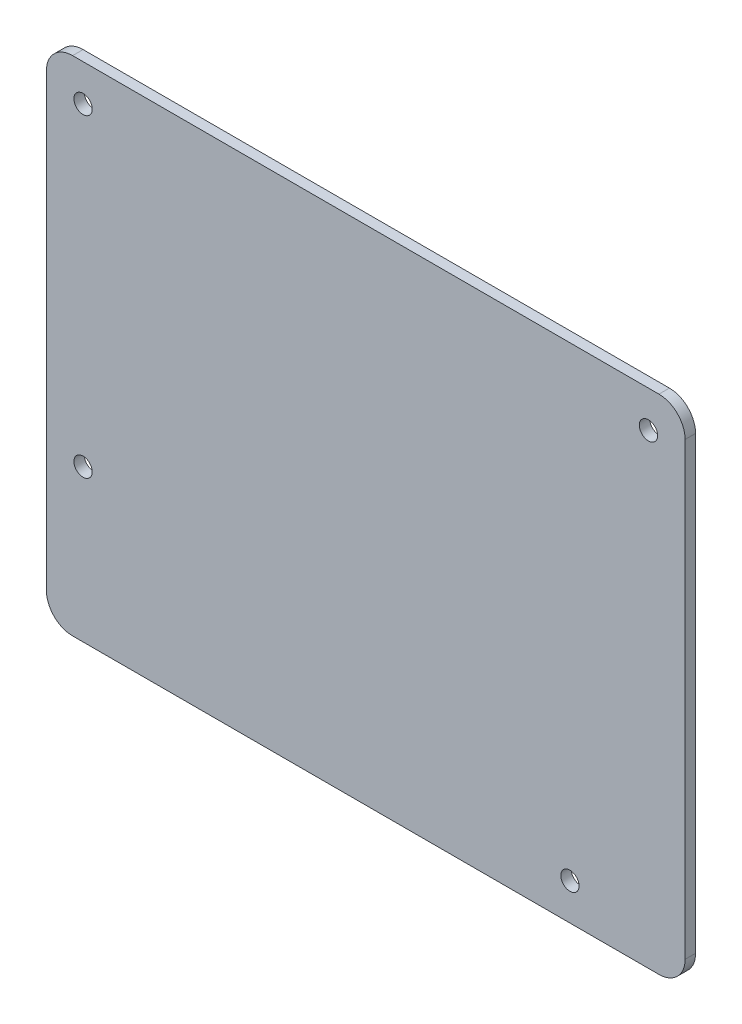
ISO-10303-21;
HEADER;
FILE_DESCRIPTION(('STEP AP214'),'2;1');
FILE_NAME('part.step','',(''),(''),'','','');
FILE_SCHEMA(('AUTOMOTIVE_DESIGN { 1 0 10303 214 1 1 1 1 }'));
ENDSEC;
DATA;
#1=APPLICATION_CONTEXT('core data for automotive mechanical design processes');
#2=APPLICATION_PROTOCOL_DEFINITION('international standard','automotive_design',2000,#1);
#3=PRODUCT_CONTEXT('',#1,'mechanical');
#4=PRODUCT('Part','Part','',(#3));
#5=PRODUCT_RELATED_PRODUCT_CATEGORY('part','',(#4));
#6=PRODUCT_DEFINITION_FORMATION('','',#4);
#7=PRODUCT_DEFINITION_CONTEXT('part definition',#1,'design');
#8=PRODUCT_DEFINITION('design','',#6,#7);
#9=PRODUCT_DEFINITION_SHAPE('','',#8);
#10=(LENGTH_UNIT() NAMED_UNIT(*) SI_UNIT(.MILLI.,.METRE.));
#11=(NAMED_UNIT(*) PLANE_ANGLE_UNIT() SI_UNIT($,.RADIAN.));
#12=(NAMED_UNIT(*) SI_UNIT($,.STERADIAN.) SOLID_ANGLE_UNIT());
#13=UNCERTAINTY_MEASURE_WITH_UNIT(LENGTH_MEASURE(1.E-05),#10,'distance_accuracy_value','');
#14=(GEOMETRIC_REPRESENTATION_CONTEXT(3) GLOBAL_UNCERTAINTY_ASSIGNED_CONTEXT((#13)) GLOBAL_UNIT_ASSIGNED_CONTEXT((#10,
#11,#12)) REPRESENTATION_CONTEXT('',''));
#15=CARTESIAN_POINT('',(0.,0.,0.));
#16=DIRECTION('',(0.,0.,1.));
#17=DIRECTION('',(1.,0.,0.));
#18=AXIS2_PLACEMENT_3D('',#15,#16,#17);
#19=CARTESIAN_POINT('',(-100.,89.,2.));
#20=DIRECTION('',(1.,0.,0.));
#21=DIRECTION('',(0.,0.,-1.));
#22=AXIS2_PLACEMENT_3D('',#19,#20,#21);
#23=PLANE('',#22);
#24=DIRECTION('',(0.,-1.,0.));
#25=VECTOR('',#24,1.);
#26=CARTESIAN_POINT('',(-100.,89.,2.));
#27=LINE('',#26,#25);
#28=CARTESIAN_POINT('',(-100.,84.,2.));
#29=VERTEX_POINT('',#28);
#30=CARTESIAN_POINT('',(-100.,-2.00000000000002,2.));
#31=VERTEX_POINT('',#30);
#32=EDGE_CURVE('E125',#29,#31,#27,.T.);
#33=ORIENTED_EDGE('',*,*,#32,.F.);
#34=DIRECTION('',(0.,0.,-1.));
#35=VECTOR('',#34,1.);
#36=CARTESIAN_POINT('',(-100.,84.,2.));
#37=LINE('',#36,#35);
#38=CARTESIAN_POINT('',(-100.,84.,0.));
#39=VERTEX_POINT('',#38);
#40=EDGE_CURVE('E151',#29,#39,#37,.T.);
#41=ORIENTED_EDGE('',*,*,#40,.T.);
#42=DIRECTION('',(0.,-1.,0.));
#43=VECTOR('',#42,1.);
#44=CARTESIAN_POINT('',(-100.,89.,0.));
#45=LINE('',#44,#43);
#46=CARTESIAN_POINT('',(-100.,-2.00000000000002,0.));
#47=VERTEX_POINT('',#46);
#48=EDGE_CURVE('E157',#39,#47,#45,.T.);
#49=ORIENTED_EDGE('',*,*,#48,.T.);
#50=DIRECTION('',(0.,0.,-1.));
#51=VECTOR('',#50,1.);
#52=CARTESIAN_POINT('',(-100.,-2.00000000000002,2.));
#53=LINE('',#52,#51);
#54=EDGE_CURVE('E149',#47,#31,#53,.F.);
#55=ORIENTED_EDGE('',*,*,#54,.T.);
#56=EDGE_LOOP('',(#33,#41,#49,#55));
#57=FACE_BOUND('',#56,.T.);
#58=ADVANCED_FACE('F33',(#57),#23,.F.);
#59=CARTESIAN_POINT('',(22.,-7.,2.));
#60=DIRECTION('',(0.,1.,0.));
#61=DIRECTION('',(-1.,0.,0.));
#62=AXIS2_PLACEMENT_3D('',#59,#60,#61);
#63=PLANE('',#62);
#64=DIRECTION('',(1.,0.,0.));
#65=VECTOR('',#64,1.);
#66=CARTESIAN_POINT('',(22.,-7.,2.));
#67=LINE('',#66,#65);
#68=CARTESIAN_POINT('',(-95.,-7.00000000000001,2.));
#69=VERTEX_POINT('',#68);
#70=CARTESIAN_POINT('',(17.,-7.,2.));
#71=VERTEX_POINT('',#70);
#72=EDGE_CURVE('E128',#69,#71,#67,.T.);
#73=ORIENTED_EDGE('',*,*,#72,.F.);
#74=DIRECTION('',(0.,0.,-1.));
#75=VECTOR('',#74,1.);
#76=CARTESIAN_POINT('',(-95.,-7.00000000000001,2.));
#77=LINE('',#76,#75);
#78=CARTESIAN_POINT('',(-95.,-7.00000000000001,0.));
#79=VERTEX_POINT('',#78);
#80=EDGE_CURVE('E11',#69,#79,#77,.T.);
#81=ORIENTED_EDGE('',*,*,#80,.T.);
#82=DIRECTION('',(1.,0.,0.));
#83=VECTOR('',#82,1.);
#84=CARTESIAN_POINT('',(22.,-7.,0.));
#85=LINE('',#84,#83);
#86=CARTESIAN_POINT('',(17.,-7.,0.));
#87=VERTEX_POINT('',#86);
#88=EDGE_CURVE('E130',#79,#87,#85,.T.);
#89=ORIENTED_EDGE('',*,*,#88,.T.);
#90=DIRECTION('',(0.,0.,-1.));
#91=VECTOR('',#90,1.);
#92=CARTESIAN_POINT('',(17.,-7.,2.));
#93=LINE('',#92,#91);
#94=EDGE_CURVE('E41',#87,#71,#93,.F.);
#95=ORIENTED_EDGE('',*,*,#94,.T.);
#96=EDGE_LOOP('',(#73,#81,#89,#95));
#97=FACE_BOUND('',#96,.T.);
#98=ADVANCED_FACE('F211',(#97),#63,.F.);
#99=CARTESIAN_POINT('',(22.,89.,2.));
#100=DIRECTION('',(-1.,0.,0.));
#101=DIRECTION('',(0.,-1.,0.));
#102=AXIS2_PLACEMENT_3D('',#99,#100,#101);
#103=PLANE('',#102);
#104=DIRECTION('',(0.,1.,0.));
#105=VECTOR('',#104,1.);
#106=CARTESIAN_POINT('',(22.,89.,0.));
#107=LINE('',#106,#105);
#108=CARTESIAN_POINT('',(22.,-2.,0.));
#109=VERTEX_POINT('',#108);
#110=CARTESIAN_POINT('',(22.,84.,0.));
#111=VERTEX_POINT('',#110);
#112=EDGE_CURVE('E126',#109,#111,#107,.T.);
#113=ORIENTED_EDGE('',*,*,#112,.T.);
#114=DIRECTION('',(0.,0.,-1.));
#115=VECTOR('',#114,1.);
#116=CARTESIAN_POINT('',(22.,84.,2.));
#117=LINE('',#116,#115);
#118=CARTESIAN_POINT('',(22.,84.,2.));
#119=VERTEX_POINT('',#118);
#120=EDGE_CURVE('E104',#111,#119,#117,.F.);
#121=ORIENTED_EDGE('',*,*,#120,.T.);
#122=DIRECTION('',(0.,1.,0.));
#123=VECTOR('',#122,1.);
#124=CARTESIAN_POINT('',(22.,89.,2.));
#125=LINE('',#124,#123);
#126=CARTESIAN_POINT('',(22.,-2.,2.));
#127=VERTEX_POINT('',#126);
#128=EDGE_CURVE('E169',#127,#119,#125,.T.);
#129=ORIENTED_EDGE('',*,*,#128,.F.);
#130=DIRECTION('',(0.,0.,-1.));
#131=VECTOR('',#130,1.);
#132=CARTESIAN_POINT('',(22.,-2.,2.));
#133=LINE('',#132,#131);
#134=EDGE_CURVE('E109',#127,#109,#133,.T.);
#135=ORIENTED_EDGE('',*,*,#134,.T.);
#136=EDGE_LOOP('',(#113,#121,#129,#135));
#137=FACE_BOUND('',#136,.T.);
#138=ADVANCED_FACE('F209',(#137),#103,.F.);
#139=CARTESIAN_POINT('',(22.,89.,2.));
#140=DIRECTION('',(0.,-1.,0.));
#141=DIRECTION('',(1.,0.,0.));
#142=AXIS2_PLACEMENT_3D('',#139,#140,#141);
#143=PLANE('',#142);
#144=DIRECTION('',(-1.,0.,0.));
#145=VECTOR('',#144,1.);
#146=CARTESIAN_POINT('',(22.,89.,2.));
#147=LINE('',#146,#145);
#148=CARTESIAN_POINT('',(17.,89.,2.));
#149=VERTEX_POINT('',#148);
#150=CARTESIAN_POINT('',(-95.,89.,2.));
#151=VERTEX_POINT('',#150);
#152=EDGE_CURVE('E119',#149,#151,#147,.T.);
#153=ORIENTED_EDGE('',*,*,#152,.F.);
#154=DIRECTION('',(0.,0.,-1.));
#155=VECTOR('',#154,1.);
#156=CARTESIAN_POINT('',(17.,89.,2.));
#157=LINE('',#156,#155);
#158=CARTESIAN_POINT('',(17.,89.,0.));
#159=VERTEX_POINT('',#158);
#160=EDGE_CURVE('E103',#149,#159,#157,.T.);
#161=ORIENTED_EDGE('',*,*,#160,.T.);
#162=DIRECTION('',(-1.,0.,0.));
#163=VECTOR('',#162,1.);
#164=CARTESIAN_POINT('',(22.,89.,0.));
#165=LINE('',#164,#163);
#166=CARTESIAN_POINT('',(-95.,89.,0.));
#167=VERTEX_POINT('',#166);
#168=EDGE_CURVE('E116',#159,#167,#165,.T.);
#169=ORIENTED_EDGE('',*,*,#168,.T.);
#170=DIRECTION('',(0.,0.,-1.));
#171=VECTOR('',#170,1.);
#172=CARTESIAN_POINT('',(-95.,89.,2.));
#173=LINE('',#172,#171);
#174=EDGE_CURVE('E121',#167,#151,#173,.F.);
#175=ORIENTED_EDGE('',*,*,#174,.T.);
#176=EDGE_LOOP('',(#153,#161,#169,#175));
#177=FACE_BOUND('',#176,.T.);
#178=ADVANCED_FACE('F115',(#177),#143,.F.);
#179=CARTESIAN_POINT('',(0.,0.,2.));
#180=DIRECTION('',(0.,0.,-1.));
#181=DIRECTION('',(-1.,0.,0.));
#182=AXIS2_PLACEMENT_3D('',#179,#180,#181);
#183=PLANE('',#182);
#184=CARTESIAN_POINT('',(0.,0.,2.));
#185=DIRECTION('',(0.,0.,1.));
#186=DIRECTION('',(1.,0.,0.));
#187=AXIS2_PLACEMENT_3D('',#184,#185,#186);
#188=CIRCLE('',#187,1.75);
#189=CARTESIAN_POINT('',(1.75,0.,2.));
#190=VERTEX_POINT('',#189);
#191=EDGE_CURVE('E190',#190,#190,#188,.T.);
#192=ORIENTED_EDGE('',*,*,#191,.F.);
#193=EDGE_LOOP('',(#192));
#194=FACE_BOUND('',#193,.T.);
#195=CARTESIAN_POINT('',(15.,82.,2.));
#196=DIRECTION('',(0.,0.,1.));
#197=DIRECTION('',(1.,0.,0.));
#198=AXIS2_PLACEMENT_3D('',#195,#196,#197);
#199=CIRCLE('',#198,1.74999999999999);
#200=CARTESIAN_POINT('',(16.75,82.,2.));
#201=VERTEX_POINT('',#200);
#202=EDGE_CURVE('E184',#201,#201,#199,.T.);
#203=ORIENTED_EDGE('',*,*,#202,.F.);
#204=EDGE_LOOP('',(#203));
#205=FACE_BOUND('',#204,.T.);
#206=CARTESIAN_POINT('',(-93.,82.,2.));
#207=DIRECTION('',(0.,0.,1.));
#208=DIRECTION('',(1.,0.,0.));
#209=AXIS2_PLACEMENT_3D('',#206,#207,#208);
#210=CIRCLE('',#209,1.75);
#211=CARTESIAN_POINT('',(-91.25,82.,2.));
#212=VERTEX_POINT('',#211);
#213=EDGE_CURVE('E178',#212,#212,#210,.T.);
#214=ORIENTED_EDGE('',*,*,#213,.F.);
#215=EDGE_LOOP('',(#214));
#216=FACE_BOUND('',#215,.T.);
#217=CARTESIAN_POINT('',(-93.,22.,2.));
#218=DIRECTION('',(0.,0.,1.));
#219=DIRECTION('',(1.,0.,0.));
#220=AXIS2_PLACEMENT_3D('',#217,#218,#219);
#221=CIRCLE('',#220,1.75);
#222=CARTESIAN_POINT('',(-91.25,22.,2.));
#223=VERTEX_POINT('',#222);
#224=EDGE_CURVE('E165',#223,#223,#221,.T.);
#225=ORIENTED_EDGE('',*,*,#224,.F.);
#226=EDGE_LOOP('',(#225));
#227=FACE_BOUND('',#226,.T.);
#228=ORIENTED_EDGE('',*,*,#128,.T.);
#229=CARTESIAN_POINT('',(17.,84.,2.));
#230=DIRECTION('',(0.,0.,-1.));
#231=DIRECTION('',(-1.,0.,0.));
#232=AXIS2_PLACEMENT_3D('',#229,#230,#231);
#233=CIRCLE('',#232,5.);
#234=EDGE_CURVE('E147',#119,#149,#233,.F.);
#235=ORIENTED_EDGE('',*,*,#234,.T.);
#236=ORIENTED_EDGE('',*,*,#152,.T.);
#237=CARTESIAN_POINT('',(-95.,84.,2.));
#238=DIRECTION('',(0.,0.,-1.));
#239=DIRECTION('',(-1.,0.,0.));
#240=AXIS2_PLACEMENT_3D('',#237,#238,#239);
#241=CIRCLE('',#240,5.);
#242=EDGE_CURVE('E145',#151,#29,#241,.F.);
#243=ORIENTED_EDGE('',*,*,#242,.T.);
#244=ORIENTED_EDGE('',*,*,#32,.T.);
#245=CARTESIAN_POINT('',(-95.,-2.00000000000001,2.));
#246=DIRECTION('',(0.,0.,-1.));
#247=DIRECTION('',(-1.,0.,0.));
#248=AXIS2_PLACEMENT_3D('',#245,#246,#247);
#249=CIRCLE('',#248,5.);
#250=EDGE_CURVE('E54',#31,#69,#249,.F.);
#251=ORIENTED_EDGE('',*,*,#250,.T.);
#252=ORIENTED_EDGE('',*,*,#72,.T.);
#253=CARTESIAN_POINT('',(17.,-2.,2.));
#254=DIRECTION('',(0.,0.,-1.));
#255=DIRECTION('',(-1.,0.,0.));
#256=AXIS2_PLACEMENT_3D('',#253,#254,#255);
#257=CIRCLE('',#256,5.);
#258=EDGE_CURVE('E142',#71,#127,#257,.F.);
#259=ORIENTED_EDGE('',*,*,#258,.T.);
#260=EDGE_LOOP('',(#228,#235,#236,#243,#244,#251,#252,#259));
#261=FACE_BOUND('',#260,.T.);
#262=ADVANCED_FACE('F196',(#194,#205,#216,#227,#261),#183,.F.);
#263=CARTESIAN_POINT('',(0.,0.,0.));
#264=DIRECTION('',(0.,0.,-1.));
#265=DIRECTION('',(-1.,0.,0.));
#266=AXIS2_PLACEMENT_3D('',#263,#264,#265);
#267=PLANE('',#266);
#268=CARTESIAN_POINT('',(0.,0.,0.));
#269=DIRECTION('',(0.,0.,1.));
#270=DIRECTION('',(1.,0.,0.));
#271=AXIS2_PLACEMENT_3D('',#268,#269,#270);
#272=CIRCLE('',#271,1.75);
#273=CARTESIAN_POINT('',(1.75,0.,0.));
#274=VERTEX_POINT('',#273);
#275=EDGE_CURVE('E187',#274,#274,#272,.T.);
#276=ORIENTED_EDGE('',*,*,#275,.T.);
#277=EDGE_LOOP('',(#276));
#278=FACE_BOUND('',#277,.T.);
#279=CARTESIAN_POINT('',(15.,82.,0.));
#280=DIRECTION('',(0.,0.,1.));
#281=DIRECTION('',(1.,0.,0.));
#282=AXIS2_PLACEMENT_3D('',#279,#280,#281);
#283=CIRCLE('',#282,1.75);
#284=CARTESIAN_POINT('',(16.75,82.,0.));
#285=VERTEX_POINT('',#284);
#286=EDGE_CURVE('E181',#285,#285,#283,.T.);
#287=ORIENTED_EDGE('',*,*,#286,.T.);
#288=EDGE_LOOP('',(#287));
#289=FACE_BOUND('',#288,.T.);
#290=CARTESIAN_POINT('',(-93.,82.,0.));
#291=DIRECTION('',(0.,0.,1.));
#292=DIRECTION('',(1.,0.,0.));
#293=AXIS2_PLACEMENT_3D('',#290,#291,#292);
#294=CIRCLE('',#293,1.75);
#295=CARTESIAN_POINT('',(-91.25,82.,0.));
#296=VERTEX_POINT('',#295);
#297=EDGE_CURVE('E175',#296,#296,#294,.T.);
#298=ORIENTED_EDGE('',*,*,#297,.T.);
#299=EDGE_LOOP('',(#298));
#300=FACE_BOUND('',#299,.T.);
#301=CARTESIAN_POINT('',(-93.,22.,0.));
#302=DIRECTION('',(0.,0.,1.));
#303=DIRECTION('',(1.,0.,0.));
#304=AXIS2_PLACEMENT_3D('',#301,#302,#303);
#305=CIRCLE('',#304,1.75);
#306=CARTESIAN_POINT('',(-91.25,22.,0.));
#307=VERTEX_POINT('',#306);
#308=EDGE_CURVE('E162',#307,#307,#305,.T.);
#309=ORIENTED_EDGE('',*,*,#308,.T.);
#310=EDGE_LOOP('',(#309));
#311=FACE_BOUND('',#310,.T.);
#312=ORIENTED_EDGE('',*,*,#168,.F.);
#313=CARTESIAN_POINT('',(17.,84.,0.));
#314=DIRECTION('',(0.,0.,-1.));
#315=DIRECTION('',(-1.,0.,0.));
#316=AXIS2_PLACEMENT_3D('',#313,#314,#315);
#317=CIRCLE('',#316,5.);
#318=EDGE_CURVE('E99',#159,#111,#317,.T.);
#319=ORIENTED_EDGE('',*,*,#318,.T.);
#320=ORIENTED_EDGE('',*,*,#112,.F.);
#321=CARTESIAN_POINT('',(17.,-2.,0.));
#322=DIRECTION('',(0.,0.,-1.));
#323=DIRECTION('',(-1.,0.,0.));
#324=AXIS2_PLACEMENT_3D('',#321,#322,#323);
#325=CIRCLE('',#324,5.);
#326=EDGE_CURVE('E120',#109,#87,#325,.T.);
#327=ORIENTED_EDGE('',*,*,#326,.T.);
#328=ORIENTED_EDGE('',*,*,#88,.F.);
#329=CARTESIAN_POINT('',(-95.,-2.00000000000001,0.));
#330=DIRECTION('',(0.,0.,-1.));
#331=DIRECTION('',(-1.,0.,0.));
#332=AXIS2_PLACEMENT_3D('',#329,#330,#331);
#333=CIRCLE('',#332,5.);
#334=EDGE_CURVE('E136',#79,#47,#333,.T.);
#335=ORIENTED_EDGE('',*,*,#334,.T.);
#336=ORIENTED_EDGE('',*,*,#48,.F.);
#337=CARTESIAN_POINT('',(-95.,84.,0.));
#338=DIRECTION('',(0.,0.,-1.));
#339=DIRECTION('',(-1.,0.,0.));
#340=AXIS2_PLACEMENT_3D('',#337,#338,#339);
#341=CIRCLE('',#340,5.);
#342=EDGE_CURVE('E110',#39,#167,#341,.T.);
#343=ORIENTED_EDGE('',*,*,#342,.T.);
#344=EDGE_LOOP('',(#312,#319,#320,#327,#328,#335,#336,#343));
#345=FACE_BOUND('',#344,.T.);
#346=ADVANCED_FACE('F123',(#278,#289,#300,#311,#345),#267,.T.);
#347=CARTESIAN_POINT('',(-93.,22.,2.));
#348=DIRECTION('',(0.,0.,1.));
#349=DIRECTION('',(1.,0.,0.));
#350=AXIS2_PLACEMENT_3D('',#347,#348,#349);
#351=CYLINDRICAL_SURFACE('',#350,1.75);
#352=ORIENTED_EDGE('',*,*,#308,.F.);
#353=EDGE_LOOP('',(#352));
#354=FACE_BOUND('',#353,.T.);
#355=ORIENTED_EDGE('',*,*,#224,.T.);
#356=EDGE_LOOP('',(#355));
#357=FACE_BOUND('',#356,.T.);
#358=ADVANCED_FACE('F235',(#354,#357),#351,.F.);
#359=CARTESIAN_POINT('',(-93.,82.,2.));
#360=DIRECTION('',(0.,0.,1.));
#361=DIRECTION('',(1.,0.,0.));
#362=AXIS2_PLACEMENT_3D('',#359,#360,#361);
#363=CYLINDRICAL_SURFACE('',#362,1.75);
#364=ORIENTED_EDGE('',*,*,#297,.F.);
#365=EDGE_LOOP('',(#364));
#366=FACE_BOUND('',#365,.T.);
#367=ORIENTED_EDGE('',*,*,#213,.T.);
#368=EDGE_LOOP('',(#367));
#369=FACE_BOUND('',#368,.T.);
#370=ADVANCED_FACE('F240',(#366,#369),#363,.F.);
#371=CARTESIAN_POINT('',(15.,82.,2.));
#372=DIRECTION('',(0.,0.,1.));
#373=DIRECTION('',(1.,0.,0.));
#374=AXIS2_PLACEMENT_3D('',#371,#372,#373);
#375=CYLINDRICAL_SURFACE('',#374,1.75);
#376=ORIENTED_EDGE('',*,*,#286,.F.);
#377=EDGE_LOOP('',(#376));
#378=FACE_BOUND('',#377,.T.);
#379=ORIENTED_EDGE('',*,*,#202,.T.);
#380=EDGE_LOOP('',(#379));
#381=FACE_BOUND('',#380,.T.);
#382=ADVANCED_FACE('F244',(#378,#381),#375,.F.);
#383=CARTESIAN_POINT('',(0.,0.,2.));
#384=DIRECTION('',(0.,0.,1.));
#385=DIRECTION('',(1.,0.,0.));
#386=AXIS2_PLACEMENT_3D('',#383,#384,#385);
#387=CYLINDRICAL_SURFACE('',#386,1.75);
#388=ORIENTED_EDGE('',*,*,#275,.F.);
#389=EDGE_LOOP('',(#388));
#390=FACE_BOUND('',#389,.T.);
#391=ORIENTED_EDGE('',*,*,#191,.T.);
#392=EDGE_LOOP('',(#391));
#393=FACE_BOUND('',#392,.T.);
#394=ADVANCED_FACE('F194',(#390,#393),#387,.F.);
#395=CARTESIAN_POINT('',(17.,84.,2.));
#396=DIRECTION('',(0.,0.,-1.));
#397=DIRECTION('',(-1.,0.,0.));
#398=AXIS2_PLACEMENT_3D('',#395,#396,#397);
#399=CYLINDRICAL_SURFACE('',#398,5.);
#400=ORIENTED_EDGE('',*,*,#234,.F.);
#401=ORIENTED_EDGE('',*,*,#120,.F.);
#402=ORIENTED_EDGE('',*,*,#318,.F.);
#403=ORIENTED_EDGE('',*,*,#160,.F.);
#404=EDGE_LOOP('',(#400,#401,#402,#403));
#405=FACE_BOUND('',#404,.T.);
#406=ADVANCED_FACE('F102',(#405),#399,.T.);
#407=CARTESIAN_POINT('',(-95.,84.,2.));
#408=DIRECTION('',(0.,0.,-1.));
#409=DIRECTION('',(-1.,0.,0.));
#410=AXIS2_PLACEMENT_3D('',#407,#408,#409);
#411=CYLINDRICAL_SURFACE('',#410,5.);
#412=ORIENTED_EDGE('',*,*,#242,.F.);
#413=ORIENTED_EDGE('',*,*,#174,.F.);
#414=ORIENTED_EDGE('',*,*,#342,.F.);
#415=ORIENTED_EDGE('',*,*,#40,.F.);
#416=EDGE_LOOP('',(#412,#413,#414,#415));
#417=FACE_BOUND('',#416,.T.);
#418=ADVANCED_FACE('F215',(#417),#411,.T.);
#419=CARTESIAN_POINT('',(-95.,-2.00000000000001,2.));
#420=DIRECTION('',(0.,0.,-1.));
#421=DIRECTION('',(-1.,0.,0.));
#422=AXIS2_PLACEMENT_3D('',#419,#420,#421);
#423=CYLINDRICAL_SURFACE('',#422,5.);
#424=ORIENTED_EDGE('',*,*,#250,.F.);
#425=ORIENTED_EDGE('',*,*,#54,.F.);
#426=ORIENTED_EDGE('',*,*,#334,.F.);
#427=ORIENTED_EDGE('',*,*,#80,.F.);
#428=EDGE_LOOP('',(#424,#425,#426,#427));
#429=FACE_BOUND('',#428,.T.);
#430=ADVANCED_FACE('F214',(#429),#423,.T.);
#431=CARTESIAN_POINT('',(17.,-2.,2.));
#432=DIRECTION('',(0.,0.,-1.));
#433=DIRECTION('',(-1.,0.,0.));
#434=AXIS2_PLACEMENT_3D('',#431,#432,#433);
#435=CYLINDRICAL_SURFACE('',#434,5.);
#436=ORIENTED_EDGE('',*,*,#258,.F.);
#437=ORIENTED_EDGE('',*,*,#94,.F.);
#438=ORIENTED_EDGE('',*,*,#326,.F.);
#439=ORIENTED_EDGE('',*,*,#134,.F.);
#440=EDGE_LOOP('',(#436,#437,#438,#439));
#441=FACE_BOUND('',#440,.T.);
#442=ADVANCED_FACE('F35',(#441),#435,.T.);
#443=CLOSED_SHELL('',(#58,#98,#138,#178,#262,#346,#358,#370,#382,#394,#406,#418,#430,#442));
#444=MANIFOLD_SOLID_BREP('B2',#443);
#445=ADVANCED_BREP_SHAPE_REPRESENTATION('',(#18,#444),#14);
#446=SHAPE_DEFINITION_REPRESENTATION(#9,#445);
ENDSEC;
END-ISO-10303-21;
